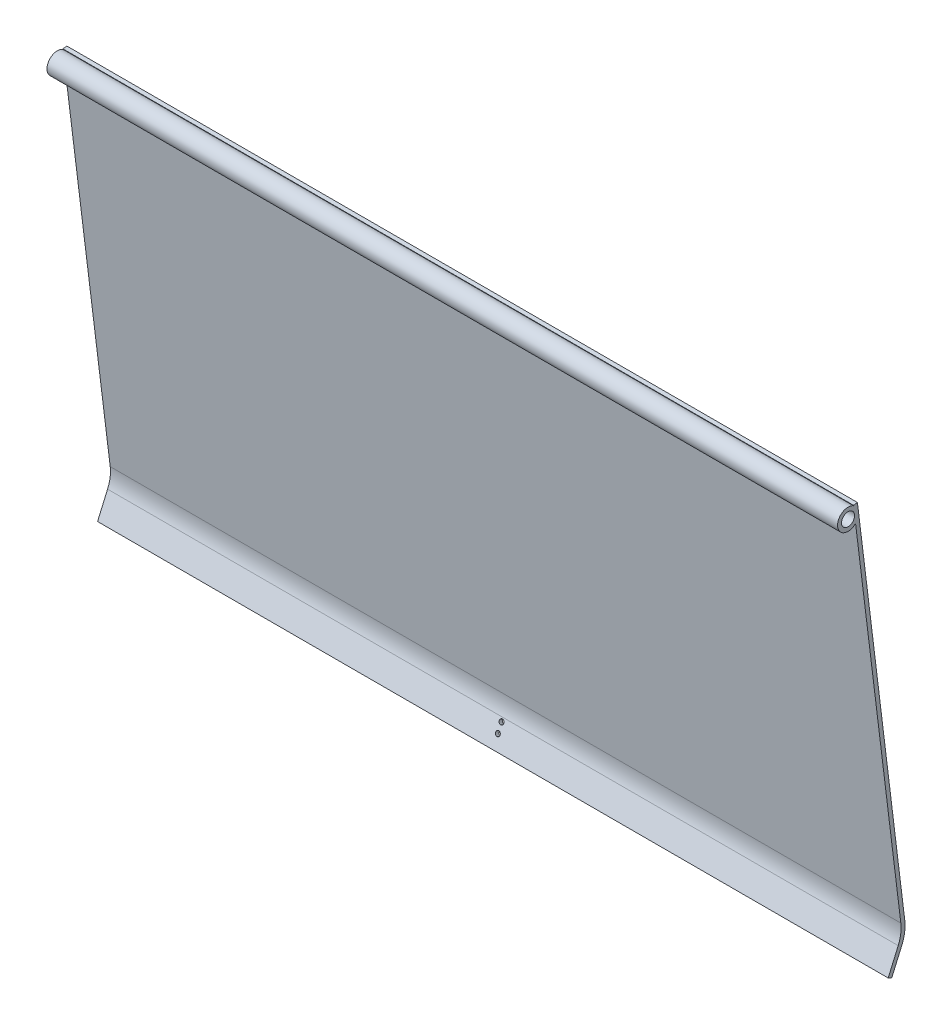
ISO-10303-21;
HEADER;
FILE_DESCRIPTION(('STEP AP214'),'2;1');
FILE_NAME('part.step','',(''),(''),'','','');
FILE_SCHEMA(('AUTOMOTIVE_DESIGN { 1 0 10303 214 1 1 1 1 }'));
ENDSEC;
DATA;
#1=APPLICATION_CONTEXT('core data for automotive mechanical design processes');
#2=APPLICATION_PROTOCOL_DEFINITION('international standard','automotive_design',2000,#1);
#3=PRODUCT_CONTEXT('',#1,'mechanical');
#4=PRODUCT('Part','Part','',(#3));
#5=PRODUCT_RELATED_PRODUCT_CATEGORY('part','',(#4));
#6=PRODUCT_DEFINITION_FORMATION('','',#4);
#7=PRODUCT_DEFINITION_CONTEXT('part definition',#1,'design');
#8=PRODUCT_DEFINITION('design','',#6,#7);
#9=PRODUCT_DEFINITION_SHAPE('','',#8);
#10=(LENGTH_UNIT() NAMED_UNIT(*) SI_UNIT(.MILLI.,.METRE.));
#11=(NAMED_UNIT(*) PLANE_ANGLE_UNIT() SI_UNIT($,.RADIAN.));
#12=(NAMED_UNIT(*) SI_UNIT($,.STERADIAN.) SOLID_ANGLE_UNIT());
#13=UNCERTAINTY_MEASURE_WITH_UNIT(LENGTH_MEASURE(1.E-05),#10,'distance_accuracy_value','');
#14=(GEOMETRIC_REPRESENTATION_CONTEXT(3) GLOBAL_UNCERTAINTY_ASSIGNED_CONTEXT((#13)) GLOBAL_UNIT_ASSIGNED_CONTEXT((#10,
#11,#12)) REPRESENTATION_CONTEXT('',''));
#15=CARTESIAN_POINT('',(0.,0.,0.));
#16=DIRECTION('',(0.,0.,1.));
#17=DIRECTION('',(1.,0.,0.));
#18=AXIS2_PLACEMENT_3D('',#15,#16,#17);
#19=CARTESIAN_POINT('',(300.,-47.9921510271972,390.864703789156));
#20=DIRECTION('',(0.,-0.121869343405152,0.992546151641321));
#21=DIRECTION('',(0.,-0.992546151641321,-0.121869343405152));
#22=AXIS2_PLACEMENT_3D('',#19,#20,#21);
#23=PLANE('',#22);
#24=DIRECTION('',(0.,0.992546151641321,0.121869343405152));
#25=VECTOR('',#24,1.);
#26=CARTESIAN_POINT('',(-300.,-47.9921510271972,390.864703789156));
#27=LINE('',#26,#25);
#28=CARTESIAN_POINT('',(-300.,389.909138949657,444.632221397781));
#29=VERTEX_POINT('',#28);
#30=CARTESIAN_POINT('',(-300.,390.245986843317,444.673581118496));
#31=VERTEX_POINT('',#30);
#32=EDGE_CURVE('E168',#29,#31,#27,.T.);
#33=ORIENTED_EDGE('',*,*,#32,.F.);
#34=DIRECTION('',(-1.,0.,0.));
#35=VECTOR('',#34,1.);
#36=CARTESIAN_POINT('',(300.,389.909138949657,444.632221397781));
#37=LINE('',#36,#35);
#38=CARTESIAN_POINT('',(300.,389.909138949657,444.632221397781));
#39=VERTEX_POINT('',#38);
#40=EDGE_CURVE('E11',#39,#29,#37,.T.);
#41=ORIENTED_EDGE('',*,*,#40,.F.);
#42=DIRECTION('',(0.,0.992546151641321,0.121869343405152));
#43=VECTOR('',#42,1.);
#44=CARTESIAN_POINT('',(300.,-47.9921510271972,390.864703789156));
#45=LINE('',#44,#43);
#46=CARTESIAN_POINT('',(300.,390.245986843317,444.673581118496));
#47=VERTEX_POINT('',#46);
#48=EDGE_CURVE('E259',#39,#47,#45,.T.);
#49=ORIENTED_EDGE('',*,*,#48,.T.);
#50=DIRECTION('',(-1.,0.,0.));
#51=VECTOR('',#50,1.);
#52=CARTESIAN_POINT('',(300.,390.245986843317,444.673581118496));
#53=LINE('',#52,#51);
#54=EDGE_CURVE('E93',#47,#31,#53,.T.);
#55=ORIENTED_EDGE('',*,*,#54,.T.);
#56=EDGE_LOOP('',(#33,#41,#49,#55));
#57=FACE_BOUND('',#56,.T.);
#58=ADVANCED_FACE('F36',(#57),#23,.T.);
#59=CARTESIAN_POINT('',(300.,383.12074359706,448.803644294319));
#60=DIRECTION('',(-1.,0.,0.));
#61=DIRECTION('',(0.,0.,1.));
#62=AXIS2_PLACEMENT_3D('',#59,#60,#61);
#63=CYLINDRICAL_SURFACE('',#62,7.96762702722213);
#64=CARTESIAN_POINT('',(-300.,383.12074359706,448.803644294319));
#65=DIRECTION('',(1.,0.,0.));
#66=DIRECTION('',(0.,0.,-1.));
#67=AXIS2_PLACEMENT_3D('',#64,#65,#66);
#68=CIRCLE('',#67,7.96762702722213);
#69=CARTESIAN_POINT('',(-300.,377.543151132641,443.113869013538));
#70=VERTEX_POINT('',#69);
#71=EDGE_CURVE('E166',#29,#70,#68,.T.);
#72=ORIENTED_EDGE('',*,*,#71,.T.);
#73=DIRECTION('',(-1.,0.,0.));
#74=VECTOR('',#73,1.);
#75=CARTESIAN_POINT('',(300.,377.543151132641,443.113869013538));
#76=LINE('',#75,#74);
#77=CARTESIAN_POINT('',(300.,377.543151132641,443.113869013538));
#78=VERTEX_POINT('',#77);
#79=EDGE_CURVE('E45',#78,#70,#76,.T.);
#80=ORIENTED_EDGE('',*,*,#79,.F.);
#81=CARTESIAN_POINT('',(300.,383.12074359706,448.803644294319));
#82=DIRECTION('',(1.,0.,0.));
#83=DIRECTION('',(0.,0.,-1.));
#84=AXIS2_PLACEMENT_3D('',#81,#82,#83);
#85=CIRCLE('',#84,7.96762702722213);
#86=EDGE_CURVE('E261',#39,#78,#85,.T.);
#87=ORIENTED_EDGE('',*,*,#86,.F.);
#88=ORIENTED_EDGE('',*,*,#40,.T.);
#89=EDGE_LOOP('',(#72,#80,#87,#88));
#90=FACE_BOUND('',#89,.T.);
#91=ADVANCED_FACE('F167',(#90),#63,.T.);
#92=CARTESIAN_POINT('',(300.,-47.9921510271972,390.864703789156));
#93=DIRECTION('',(0.,-0.121869343405152,0.992546151641321));
#94=DIRECTION('',(0.,-0.992546151641321,-0.121869343405152));
#95=AXIS2_PLACEMENT_3D('',#92,#93,#94);
#96=PLANE('',#95);
#97=DIRECTION('',(0.,0.992546151641321,0.121869343405152));
#98=VECTOR('',#97,1.);
#99=CARTESIAN_POINT('',(-300.,-47.9921510271972,390.864703789156));
#100=LINE('',#99,#98);
#101=CARTESIAN_POINT('',(-300.,97.6966862423294,408.75304370175));
#102=VERTEX_POINT('',#101);
#103=EDGE_CURVE('E160',#102,#70,#100,.T.);
#104=ORIENTED_EDGE('',*,*,#103,.F.);
#105=DIRECTION('',(-1.,0.,0.));
#106=VECTOR('',#105,1.);
#107=CARTESIAN_POINT('',(300.,97.6966862423294,408.75304370175));
#108=LINE('',#107,#106);
#109=CARTESIAN_POINT('',(300.,97.6966862423294,408.75304370175));
#110=VERTEX_POINT('',#109);
#111=EDGE_CURVE('E152',#110,#102,#108,.T.);
#112=ORIENTED_EDGE('',*,*,#111,.F.);
#113=DIRECTION('',(0.,0.992546151641321,0.121869343405152));
#114=VECTOR('',#113,1.);
#115=CARTESIAN_POINT('',(300.,-47.9921510271972,390.864703789156));
#116=LINE('',#115,#114);
#117=EDGE_CURVE('E163',#110,#78,#116,.T.);
#118=ORIENTED_EDGE('',*,*,#117,.T.);
#119=ORIENTED_EDGE('',*,*,#79,.T.);
#120=EDGE_LOOP('',(#104,#112,#118,#119));
#121=FACE_BOUND('',#120,.T.);
#122=ADVANCED_FACE('F158',(#121),#96,.T.);
#123=CARTESIAN_POINT('',(300.,94.4671486420929,435.055516720245));
#124=DIRECTION('',(-1.,0.,0.));
#125=DIRECTION('',(0.,0.,1.));
#126=AXIS2_PLACEMENT_3D('',#123,#124,#125);
#127=CYLINDRICAL_SURFACE('',#126,26.5000000000001);
#128=CARTESIAN_POINT('',(-300.,94.4671486420929,435.055516720245));
#129=DIRECTION('',(1.,0.,0.));
#130=DIRECTION('',(0.,0.,-1.));
#131=AXIS2_PLACEMENT_3D('',#128,#129,#130);
#132=CIRCLE('',#131,26.5000000000001);
#133=CARTESIAN_POINT('',(-300.,83.8923152977072,410.756897423288));
#134=VERTEX_POINT('',#133);
#135=EDGE_CURVE('E173',#134,#102,#132,.T.);
#136=ORIENTED_EDGE('',*,*,#135,.F.);
#137=DIRECTION('',(-1.,0.,0.));
#138=VECTOR('',#137,1.);
#139=CARTESIAN_POINT('',(300.,83.8923152977072,410.756897423288));
#140=LINE('',#139,#138);
#141=CARTESIAN_POINT('',(300.,83.8923152977072,410.756897423288));
#142=VERTEX_POINT('',#141);
#143=EDGE_CURVE('E150',#142,#134,#140,.T.);
#144=ORIENTED_EDGE('',*,*,#143,.F.);
#145=CARTESIAN_POINT('',(300.,94.4671486420929,435.055516720245));
#146=DIRECTION('',(1.,0.,0.));
#147=DIRECTION('',(0.,0.,-1.));
#148=AXIS2_PLACEMENT_3D('',#145,#146,#147);
#149=CIRCLE('',#148,26.5000000000001);
#150=EDGE_CURVE('E264',#142,#110,#149,.T.);
#151=ORIENTED_EDGE('',*,*,#150,.T.);
#152=ORIENTED_EDGE('',*,*,#111,.T.);
#153=EDGE_LOOP('',(#136,#144,#151,#152));
#154=FACE_BOUND('',#153,.T.);
#155=ADVANCED_FACE('F203',(#154),#127,.F.);
#156=CARTESIAN_POINT('',(300.,163.655393922174,376.043761949187));
#157=DIRECTION('',(0.,0.399050314882478,0.916929030073863));
#158=DIRECTION('',(0.,-0.916929030073863,0.399050314882478));
#159=AXIS2_PLACEMENT_3D('',#156,#157,#158);
#160=PLANE('',#159);
#161=CARTESIAN_POINT('',(0.,81.4374970901088,411.825241806105));
#162=DIRECTION('',(0.,0.399050314882478,0.916929030073863));
#163=DIRECTION('',(0.,-0.916929030073863,0.399050314882478));
#164=AXIS2_PLACEMENT_3D('',#161,#162,#163);
#165=CIRCLE('',#164,1.75);
#166=CARTESIAN_POINT('',(0.,79.8328712874795,412.523579857149));
#167=VERTEX_POINT('',#166);
#168=EDGE_CURVE('E245',#167,#167,#165,.T.);
#169=ORIENTED_EDGE('',*,*,#168,.F.);
#170=EDGE_LOOP('',(#169));
#171=FACE_BOUND('',#170,.T.);
#172=CARTESIAN_POINT('',(0.,75.1510018731667,414.561143728226));
#173=DIRECTION('',(0.,0.399050314882478,0.916929030073863));
#174=DIRECTION('',(0.,-0.916929030073863,0.399050314882478));
#175=AXIS2_PLACEMENT_3D('',#172,#173,#174);
#176=CIRCLE('',#175,1.75);
#177=CARTESIAN_POINT('',(0.,73.5463760705375,415.259481779271));
#178=VERTEX_POINT('',#177);
#179=EDGE_CURVE('E249',#178,#178,#176,.T.);
#180=ORIENTED_EDGE('',*,*,#179,.F.);
#181=EDGE_LOOP('',(#180));
#182=FACE_BOUND('',#181,.T.);
#183=DIRECTION('',(0.,0.916929030073863,-0.399050314882478));
#184=VECTOR('',#183,1.);
#185=CARTESIAN_POINT('',(-300.,163.655393922174,376.043761949187));
#186=LINE('',#185,#184);
#187=CARTESIAN_POINT('',(-300.,66.4096884486262,418.365390033165));
#188=VERTEX_POINT('',#187);
#189=EDGE_CURVE('E175',#188,#134,#186,.T.);
#190=ORIENTED_EDGE('',*,*,#189,.F.);
#191=DIRECTION('',(-1.,0.,0.));
#192=VECTOR('',#191,1.);
#193=CARTESIAN_POINT('',(300.,66.4096884486262,418.365390033165));
#194=LINE('',#193,#192);
#195=CARTESIAN_POINT('',(300.,66.4096884486262,418.365390033165));
#196=VERTEX_POINT('',#195);
#197=EDGE_CURVE('E148',#196,#188,#194,.T.);
#198=ORIENTED_EDGE('',*,*,#197,.F.);
#199=DIRECTION('',(0.,0.916929030073863,-0.399050314882478));
#200=VECTOR('',#199,1.);
#201=CARTESIAN_POINT('',(300.,163.655393922174,376.043761949187));
#202=LINE('',#201,#200);
#203=EDGE_CURVE('E267',#196,#142,#202,.T.);
#204=ORIENTED_EDGE('',*,*,#203,.T.);
#205=ORIENTED_EDGE('',*,*,#143,.T.);
#206=EDGE_LOOP('',(#190,#198,#204,#205));
#207=FACE_BOUND('',#206,.T.);
#208=ADVANCED_FACE('F206',(#171,#182,#207),#160,.T.);
#209=CARTESIAN_POINT('',(300.,-97.2457054735483,42.3216280839776));
#210=DIRECTION('',(0.,0.916929030073862,-0.39905031488248));
#211=DIRECTION('',(0.,0.39905031488248,0.916929030073862));
#212=AXIS2_PLACEMENT_3D('',#209,#210,#211);
#213=PLANE('',#212);
#214=DIRECTION('',(0.,-0.39905031488248,-0.916929030073862));
#215=VECTOR('',#214,1.);
#216=CARTESIAN_POINT('',(-300.,-97.2457054735483,42.3216280839776));
#217=LINE('',#216,#215);
#218=CARTESIAN_POINT('',(-300.,65.2125375039787,415.614602942943));
#219=VERTEX_POINT('',#218);
#220=EDGE_CURVE('E180',#188,#219,#217,.T.);
#221=ORIENTED_EDGE('',*,*,#220,.T.);
#222=DIRECTION('',(-1.,0.,0.));
#223=VECTOR('',#222,1.);
#224=CARTESIAN_POINT('',(300.,65.2125375039787,415.614602942943));
#225=LINE('',#224,#223);
#226=CARTESIAN_POINT('',(300.,65.2125375039787,415.614602942943));
#227=VERTEX_POINT('',#226);
#228=EDGE_CURVE('E141',#227,#219,#225,.T.);
#229=ORIENTED_EDGE('',*,*,#228,.F.);
#230=DIRECTION('',(0.,-0.39905031488248,-0.916929030073862));
#231=VECTOR('',#230,1.);
#232=CARTESIAN_POINT('',(300.,-97.2457054735483,42.3216280839776));
#233=LINE('',#232,#231);
#234=EDGE_CURVE('E270',#196,#227,#233,.T.);
#235=ORIENTED_EDGE('',*,*,#234,.F.);
#236=ORIENTED_EDGE('',*,*,#197,.T.);
#237=EDGE_LOOP('',(#221,#229,#235,#236));
#238=FACE_BOUND('',#237,.T.);
#239=ADVANCED_FACE('F210',(#238),#213,.F.);
#240=CARTESIAN_POINT('',(300.,162.458242977527,373.292974858966));
#241=DIRECTION('',(0.,0.399050314882478,0.916929030073863));
#242=DIRECTION('',(0.,-0.916929030073863,0.399050314882478));
#243=AXIS2_PLACEMENT_3D('',#240,#241,#242);
#244=PLANE('',#243);
#245=CARTESIAN_POINT('',(0.,80.2403461454613,409.074454715883));
#246=DIRECTION('',(0.,0.399050314882478,0.916929030073863));
#247=DIRECTION('',(0.,-0.916929030073863,0.399050314882478));
#248=AXIS2_PLACEMENT_3D('',#245,#246,#247);
#249=CIRCLE('',#248,1.75);
#250=CARTESIAN_POINT('',(0.,78.635720342832,409.772792766928));
#251=VERTEX_POINT('',#250);
#252=EDGE_CURVE('E248',#251,#251,#249,.F.);
#253=ORIENTED_EDGE('',*,*,#252,.F.);
#254=EDGE_LOOP('',(#253));
#255=FACE_BOUND('',#254,.T.);
#256=CARTESIAN_POINT('',(0.,73.9538509285192,411.810356638005));
#257=DIRECTION('',(0.,0.399050314882478,0.916929030073863));
#258=DIRECTION('',(0.,-0.916929030073863,0.399050314882478));
#259=AXIS2_PLACEMENT_3D('',#256,#257,#258);
#260=CIRCLE('',#259,1.75);
#261=CARTESIAN_POINT('',(0.,72.34922512589,412.508694689049));
#262=VERTEX_POINT('',#261);
#263=EDGE_CURVE('E194',#262,#262,#260,.F.);
#264=ORIENTED_EDGE('',*,*,#263,.F.);
#265=EDGE_LOOP('',(#264));
#266=FACE_BOUND('',#265,.T.);
#267=DIRECTION('',(0.,0.916929030073863,-0.399050314882478));
#268=VECTOR('',#267,1.);
#269=CARTESIAN_POINT('',(-300.,162.458242977527,373.292974858966));
#270=LINE('',#269,#268);
#271=CARTESIAN_POINT('',(-300.,82.6951643530598,408.006110333066));
#272=VERTEX_POINT('',#271);
#273=EDGE_CURVE('E183',#219,#272,#270,.T.);
#274=ORIENTED_EDGE('',*,*,#273,.T.);
#275=DIRECTION('',(-1.,0.,0.));
#276=VECTOR('',#275,1.);
#277=CARTESIAN_POINT('',(300.,82.6951643530598,408.006110333066));
#278=LINE('',#277,#276);
#279=CARTESIAN_POINT('',(300.,82.6951643530598,408.006110333066));
#280=VERTEX_POINT('',#279);
#281=EDGE_CURVE('E139',#280,#272,#278,.T.);
#282=ORIENTED_EDGE('',*,*,#281,.F.);
#283=DIRECTION('',(0.,0.916929030073863,-0.399050314882478));
#284=VECTOR('',#283,1.);
#285=CARTESIAN_POINT('',(300.,162.458242977527,373.292974858966));
#286=LINE('',#285,#284);
#287=EDGE_CURVE('E132',#227,#280,#286,.T.);
#288=ORIENTED_EDGE('',*,*,#287,.F.);
#289=ORIENTED_EDGE('',*,*,#228,.T.);
#290=EDGE_LOOP('',(#274,#282,#288,#289));
#291=FACE_BOUND('',#290,.T.);
#292=ADVANCED_FACE('F214',(#255,#266,#291),#244,.F.);
#293=CARTESIAN_POINT('',(300.,94.4671486420929,435.055516720245));
#294=DIRECTION('',(-1.,0.,0.));
#295=DIRECTION('',(0.,0.,1.));
#296=AXIS2_PLACEMENT_3D('',#293,#294,#295);
#297=CYLINDRICAL_SURFACE('',#296,29.5000000000001);
#298=CARTESIAN_POINT('',(-300.,94.4671486420929,435.055516720245));
#299=DIRECTION('',(1.,0.,0.));
#300=DIRECTION('',(0.,0.,-1.));
#301=AXIS2_PLACEMENT_3D('',#298,#299,#300);
#302=CIRCLE('',#301,29.5000000000001);
#303=CARTESIAN_POINT('',(-300.,98.0622942725448,405.775405246826));
#304=VERTEX_POINT('',#303);
#305=EDGE_CURVE('E138',#272,#304,#302,.T.);
#306=ORIENTED_EDGE('',*,*,#305,.T.);
#307=DIRECTION('',(-1.,0.,0.));
#308=VECTOR('',#307,1.);
#309=CARTESIAN_POINT('',(300.,98.0622942725448,405.775405246826));
#310=LINE('',#309,#308);
#311=CARTESIAN_POINT('',(300.,98.0622942725448,405.775405246826));
#312=VERTEX_POINT('',#311);
#313=EDGE_CURVE('E124',#312,#304,#310,.T.);
#314=ORIENTED_EDGE('',*,*,#313,.F.);
#315=CARTESIAN_POINT('',(300.,94.4671486420929,435.055516720245));
#316=DIRECTION('',(1.,0.,0.));
#317=DIRECTION('',(0.,0.,-1.));
#318=AXIS2_PLACEMENT_3D('',#315,#316,#317);
#319=CIRCLE('',#318,29.5000000000001);
#320=EDGE_CURVE('E127',#280,#312,#319,.T.);
#321=ORIENTED_EDGE('',*,*,#320,.F.);
#322=ORIENTED_EDGE('',*,*,#281,.T.);
#323=EDGE_LOOP('',(#306,#314,#321,#322));
#324=FACE_BOUND('',#323,.T.);
#325=ADVANCED_FACE('F137',(#324),#297,.T.);
#326=CARTESIAN_POINT('',(300.,-47.6265429969817,387.887065334232));
#327=DIRECTION('',(0.,-0.121869343405152,0.992546151641321));
#328=DIRECTION('',(0.,-0.992546151641321,-0.121869343405152));
#329=AXIS2_PLACEMENT_3D('',#326,#327,#328);
#330=PLANE('',#329);
#331=DIRECTION('',(0.,0.992546151641321,0.121869343405152));
#332=VECTOR('',#331,1.);
#333=CARTESIAN_POINT('',(-300.,-47.6265429969817,387.887065334232));
#334=LINE('',#333,#332);
#335=CARTESIAN_POINT('',(-300.,390.611594873533,441.695942663571));
#336=VERTEX_POINT('',#335);
#337=EDGE_CURVE('E187',#304,#336,#334,.T.);
#338=ORIENTED_EDGE('',*,*,#337,.T.);
#339=DIRECTION('',(-1.,0.,0.));
#340=VECTOR('',#339,1.);
#341=CARTESIAN_POINT('',(300.,390.611594873533,441.695942663571));
#342=LINE('',#341,#340);
#343=CARTESIAN_POINT('',(300.,390.611594873533,441.695942663571));
#344=VERTEX_POINT('',#343);
#345=EDGE_CURVE('E126',#344,#336,#342,.T.);
#346=ORIENTED_EDGE('',*,*,#345,.F.);
#347=DIRECTION('',(0.,0.992546151641321,0.121869343405152));
#348=VECTOR('',#347,1.);
#349=CARTESIAN_POINT('',(300.,-47.6265429969817,387.887065334232));
#350=LINE('',#349,#348);
#351=EDGE_CURVE('E119',#312,#344,#350,.T.);
#352=ORIENTED_EDGE('',*,*,#351,.F.);
#353=ORIENTED_EDGE('',*,*,#313,.T.);
#354=EDGE_LOOP('',(#338,#346,#352,#353));
#355=FACE_BOUND('',#354,.T.);
#356=ADVANCED_FACE('F122',(#355),#330,.F.);
#357=CARTESIAN_POINT('',(300.,383.12074359706,448.803644294319));
#358=DIRECTION('',(-1.,0.,0.));
#359=DIRECTION('',(0.,0.,1.));
#360=AXIS2_PLACEMENT_3D('',#357,#358,#359);
#361=CYLINDRICAL_SURFACE('',#360,4.96762702722214);
#362=CARTESIAN_POINT('',(300.,383.12074359706,448.803644294319));
#363=DIRECTION('',(1.,0.,0.));
#364=DIRECTION('',(0.,0.,-1.));
#365=AXIS2_PLACEMENT_3D('',#362,#363,#364);
#366=CIRCLE('',#365,4.96762702722214);
#367=CARTESIAN_POINT('',(300.,383.12074359706,443.836017267096));
#368=VERTEX_POINT('',#367);
#369=EDGE_CURVE('E189',#368,#368,#366,.T.);
#370=ORIENTED_EDGE('',*,*,#369,.T.);
#371=EDGE_LOOP('',(#370));
#372=FACE_BOUND('',#371,.T.);
#373=CARTESIAN_POINT('',(-300.,383.12074359706,448.803644294319));
#374=DIRECTION('',(1.,0.,0.));
#375=DIRECTION('',(0.,0.,-1.));
#376=AXIS2_PLACEMENT_3D('',#373,#374,#375);
#377=CIRCLE('',#376,4.96762702722214);
#378=CARTESIAN_POINT('',(-300.,383.12074359706,443.836017267096));
#379=VERTEX_POINT('',#378);
#380=EDGE_CURVE('E192',#379,#379,#377,.T.);
#381=ORIENTED_EDGE('',*,*,#380,.F.);
#382=EDGE_LOOP('',(#381));
#383=FACE_BOUND('',#382,.T.);
#384=ADVANCED_FACE('F38',(#372,#383),#361,.F.);
#385=CARTESIAN_POINT('',(300.,438.238137870508,53.8088773293307));
#386=DIRECTION('',(0.,-0.992546151641324,-0.121869343405133));
#387=DIRECTION('',(0.,0.121869343405133,-0.992546151641324));
#388=AXIS2_PLACEMENT_3D('',#385,#386,#387);
#389=PLANE('',#388);
#390=DIRECTION('',(0.,-0.121869343405134,0.992546151641324));
#391=VECTOR('',#390,1.);
#392=CARTESIAN_POINT('',(-300.,438.238137870508,53.8088773293307));
#393=LINE('',#392,#391);
#394=EDGE_CURVE('E86',#336,#31,#393,.T.);
#395=ORIENTED_EDGE('',*,*,#394,.T.);
#396=ORIENTED_EDGE('',*,*,#54,.F.);
#397=DIRECTION('',(0.,-0.121869343405134,0.992546151641324));
#398=VECTOR('',#397,1.);
#399=CARTESIAN_POINT('',(300.,438.238137870508,53.8088773293307));
#400=LINE('',#399,#398);
#401=EDGE_CURVE('E53',#344,#47,#400,.T.);
#402=ORIENTED_EDGE('',*,*,#401,.F.);
#403=ORIENTED_EDGE('',*,*,#345,.T.);
#404=EDGE_LOOP('',(#395,#396,#402,#403));
#405=FACE_BOUND('',#404,.T.);
#406=ADVANCED_FACE('F223',(#405),#389,.F.);
#407=CARTESIAN_POINT('',(300.,0.,0.));
#408=DIRECTION('',(1.,0.,0.));
#409=DIRECTION('',(0.,0.,-1.));
#410=AXIS2_PLACEMENT_3D('',#407,#408,#409);
#411=PLANE('',#410);
#412=ORIENTED_EDGE('',*,*,#369,.F.);
#413=EDGE_LOOP('',(#412));
#414=FACE_BOUND('',#413,.T.);
#415=ORIENTED_EDGE('',*,*,#48,.F.);
#416=ORIENTED_EDGE('',*,*,#86,.T.);
#417=ORIENTED_EDGE('',*,*,#117,.F.);
#418=ORIENTED_EDGE('',*,*,#150,.F.);
#419=ORIENTED_EDGE('',*,*,#203,.F.);
#420=ORIENTED_EDGE('',*,*,#234,.T.);
#421=ORIENTED_EDGE('',*,*,#287,.T.);
#422=ORIENTED_EDGE('',*,*,#320,.T.);
#423=ORIENTED_EDGE('',*,*,#351,.T.);
#424=ORIENTED_EDGE('',*,*,#401,.T.);
#425=EDGE_LOOP('',(#415,#416,#417,#418,#419,#420,#421,#422,#423,#424));
#426=FACE_BOUND('',#425,.T.);
#427=ADVANCED_FACE('F130',(#414,#426),#411,.T.);
#428=CARTESIAN_POINT('',(-300.,0.,0.));
#429=DIRECTION('',(1.,0.,0.));
#430=DIRECTION('',(0.,0.,-1.));
#431=AXIS2_PLACEMENT_3D('',#428,#429,#430);
#432=PLANE('',#431);
#433=ORIENTED_EDGE('',*,*,#380,.T.);
#434=EDGE_LOOP('',(#433));
#435=FACE_BOUND('',#434,.T.);
#436=ORIENTED_EDGE('',*,*,#32,.T.);
#437=ORIENTED_EDGE('',*,*,#394,.F.);
#438=ORIENTED_EDGE('',*,*,#337,.F.);
#439=ORIENTED_EDGE('',*,*,#305,.F.);
#440=ORIENTED_EDGE('',*,*,#273,.F.);
#441=ORIENTED_EDGE('',*,*,#220,.F.);
#442=ORIENTED_EDGE('',*,*,#189,.T.);
#443=ORIENTED_EDGE('',*,*,#135,.T.);
#444=ORIENTED_EDGE('',*,*,#103,.T.);
#445=ORIENTED_EDGE('',*,*,#71,.F.);
#446=EDGE_LOOP('',(#436,#437,#438,#439,#440,#441,#442,#443,#444,#445));
#447=FACE_BOUND('',#446,.T.);
#448=ADVANCED_FACE('F170',(#435,#447),#432,.F.);
#449=CARTESIAN_POINT('',(0.,70.2726979075605,403.351884251997));
#450=DIRECTION('',(0.,0.399050314882478,0.916929030073863));
#451=DIRECTION('',(0.,-0.916929030073863,0.399050314882478));
#452=AXIS2_PLACEMENT_3D('',#449,#450,#451);
#453=CYLINDRICAL_SURFACE('',#452,1.75);
#454=ORIENTED_EDGE('',*,*,#179,.T.);
#455=EDGE_LOOP('',(#454));
#456=FACE_BOUND('',#455,.T.);
#457=ORIENTED_EDGE('',*,*,#263,.T.);
#458=EDGE_LOOP('',(#457));
#459=FACE_BOUND('',#458,.T.);
#460=ADVANCED_FACE('F229',(#456,#459),#453,.F.);
#461=CARTESIAN_POINT('',(0.,76.5591931245026,400.615982329875));
#462=DIRECTION('',(0.,0.399050314882478,0.916929030073863));
#463=DIRECTION('',(0.,-0.916929030073863,0.399050314882478));
#464=AXIS2_PLACEMENT_3D('',#461,#462,#463);
#465=CYLINDRICAL_SURFACE('',#464,1.75);
#466=ORIENTED_EDGE('',*,*,#168,.T.);
#467=EDGE_LOOP('',(#466));
#468=FACE_BOUND('',#467,.T.);
#469=ORIENTED_EDGE('',*,*,#252,.T.);
#470=EDGE_LOOP('',(#469));
#471=FACE_BOUND('',#470,.T.);
#472=ADVANCED_FACE('F236',(#468,#471),#465,.F.);
#473=CLOSED_SHELL('',(#58,#91,#122,#155,#208,#239,#292,#325,#356,#384,#406,#427,#448,#460,#472));
#474=MANIFOLD_SOLID_BREP('B2',#473);
#475=ADVANCED_BREP_SHAPE_REPRESENTATION('',(#18,#474),#14);
#476=SHAPE_DEFINITION_REPRESENTATION(#9,#475);
ENDSEC;
END-ISO-10303-21;
